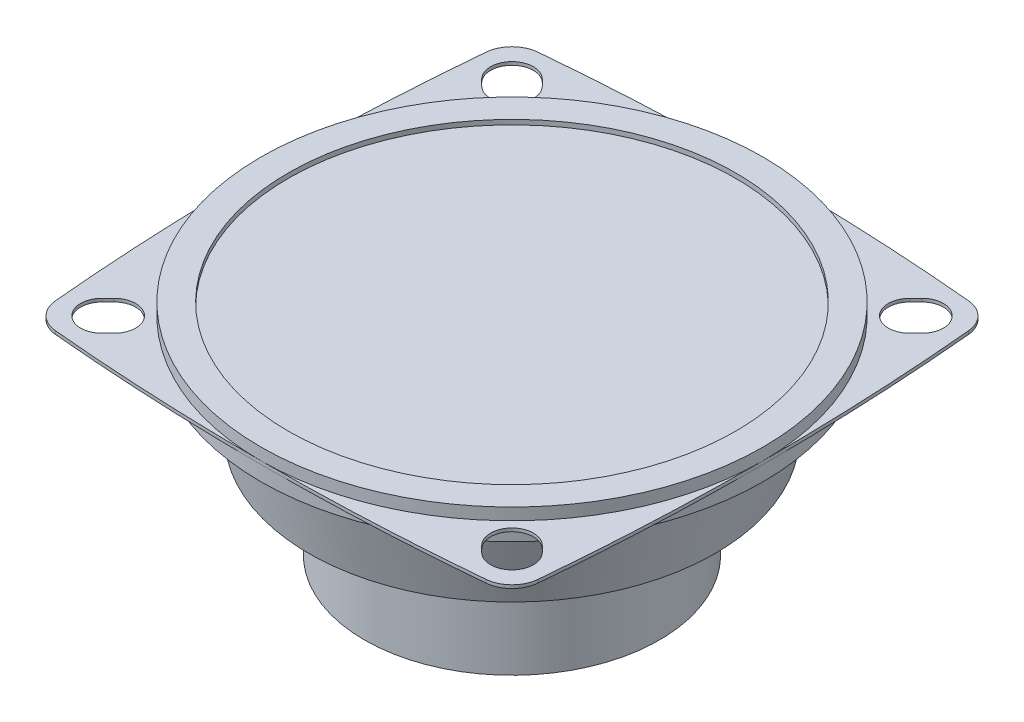
ISO-10303-21;
HEADER;
FILE_DESCRIPTION(('STEP AP214'),'2;1');
FILE_NAME('part.step','',(''),(''),'','','');
FILE_SCHEMA(('AUTOMOTIVE_DESIGN { 1 0 10303 214 1 1 1 1 }'));
ENDSEC;
DATA;
#1=APPLICATION_CONTEXT('core data for automotive mechanical design processes');
#2=APPLICATION_PROTOCOL_DEFINITION('international standard','automotive_design',2000,#1);
#3=PRODUCT_CONTEXT('',#1,'mechanical');
#4=PRODUCT('Part','Part','',(#3));
#5=PRODUCT_RELATED_PRODUCT_CATEGORY('part','',(#4));
#6=PRODUCT_DEFINITION_FORMATION('','',#4);
#7=PRODUCT_DEFINITION_CONTEXT('part definition',#1,'design');
#8=PRODUCT_DEFINITION('design','',#6,#7);
#9=PRODUCT_DEFINITION_SHAPE('','',#8);
#10=(LENGTH_UNIT() NAMED_UNIT(*) SI_UNIT(.MILLI.,.METRE.));
#11=(NAMED_UNIT(*) PLANE_ANGLE_UNIT() SI_UNIT($,.RADIAN.));
#12=(NAMED_UNIT(*) SI_UNIT($,.STERADIAN.) SOLID_ANGLE_UNIT());
#13=UNCERTAINTY_MEASURE_WITH_UNIT(LENGTH_MEASURE(1.E-05),#10,'distance_accuracy_value','');
#14=(GEOMETRIC_REPRESENTATION_CONTEXT(3) GLOBAL_UNCERTAINTY_ASSIGNED_CONTEXT((#13)) GLOBAL_UNIT_ASSIGNED_CONTEXT((#10,
#11,#12)) REPRESENTATION_CONTEXT('',''));
#15=CARTESIAN_POINT('',(0.,0.,0.));
#16=DIRECTION('',(0.,0.,1.));
#17=DIRECTION('',(1.,0.,0.));
#18=AXIS2_PLACEMENT_3D('',#15,#16,#17);
#19=CARTESIAN_POINT('',(0.,0.,0.));
#20=DIRECTION('',(0.,-1.,0.));
#21=DIRECTION('',(0.,0.,-1.));
#22=AXIS2_PLACEMENT_3D('',#19,#20,#21);
#23=CYLINDRICAL_SURFACE('',#22,26.38);
#24=CARTESIAN_POINT('',(0.,19.84,0.));
#25=DIRECTION('',(0.,-1.,0.));
#26=DIRECTION('',(0.,0.,-1.));
#27=AXIS2_PLACEMENT_3D('',#24,#25,#26);
#28=CIRCLE('',#27,26.38);
#29=CARTESIAN_POINT('',(0.,19.84,-26.38));
#30=VERTEX_POINT('',#29);
#31=EDGE_CURVE('E396',#30,#30,#28,.T.);
#32=ORIENTED_EDGE('',*,*,#31,.F.);
#33=EDGE_LOOP('',(#32));
#34=FACE_BOUND('',#33,.T.);
#35=CARTESIAN_POINT('',(0.,21.41,0.));
#36=DIRECTION('',(0.,1.,0.));
#37=DIRECTION('',(0.,0.,1.));
#38=AXIS2_PLACEMENT_3D('',#35,#36,#37);
#39=CIRCLE('',#38,26.38);
#40=CARTESIAN_POINT('',(26.38,21.41,0.));
#41=VERTEX_POINT('',#40);
#42=CARTESIAN_POINT('',(0.,21.41,26.38));
#43=VERTEX_POINT('',#42);
#44=EDGE_CURVE('E407',#41,#43,#39,.F.);
#45=ORIENTED_EDGE('',*,*,#44,.T.);
#46=CARTESIAN_POINT('',(-26.38,21.41,0.));
#47=VERTEX_POINT('',#46);
#48=EDGE_CURVE('E411',#43,#47,#39,.F.);
#49=ORIENTED_EDGE('',*,*,#48,.T.);
#50=CARTESIAN_POINT('',(0.,21.41,-26.38));
#51=VERTEX_POINT('',#50);
#52=EDGE_CURVE('E463',#47,#51,#39,.F.);
#53=ORIENTED_EDGE('',*,*,#52,.T.);
#54=EDGE_CURVE('E410',#51,#41,#39,.F.);
#55=ORIENTED_EDGE('',*,*,#54,.T.);
#56=EDGE_LOOP('',(#45,#49,#53,#55));
#57=FACE_BOUND('',#56,.T.);
#58=ADVANCED_FACE('F32',(#34,#57),#23,.T.);
#59=CARTESIAN_POINT('',(15.5,0.,0.));
#60=DIRECTION('',(0.,-1.,0.));
#61=DIRECTION('',(0.,0.,-1.));
#62=AXIS2_PLACEMENT_3D('',#59,#60,#61);
#63=PLANE('',#62);
#64=CARTESIAN_POINT('',(0.,0.,0.));
#65=DIRECTION('',(0.,-1.,0.));
#66=DIRECTION('',(0.,0.,-1.));
#67=AXIS2_PLACEMENT_3D('',#64,#65,#66);
#68=CIRCLE('',#67,15.5);
#69=CARTESIAN_POINT('',(0.,0.,-15.5));
#70=VERTEX_POINT('',#69);
#71=EDGE_CURVE('E373',#70,#70,#68,.T.);
#72=ORIENTED_EDGE('',*,*,#71,.T.);
#73=EDGE_LOOP('',(#72));
#74=FACE_BOUND('',#73,.T.);
#75=ADVANCED_FACE('F547',(#74),#63,.T.);
#76=CARTESIAN_POINT('',(26.38,19.84,0.));
#77=DIRECTION('',(0.,-1.,0.));
#78=DIRECTION('',(0.,0.,-1.));
#79=AXIS2_PLACEMENT_3D('',#76,#77,#78);
#80=PLANE('',#79);
#81=ORIENTED_EDGE('',*,*,#31,.T.);
#82=EDGE_LOOP('',(#81));
#83=FACE_BOUND('',#82,.T.);
#84=CARTESIAN_POINT('',(0.,19.84,0.));
#85=DIRECTION('',(0.,-1.,0.));
#86=DIRECTION('',(0.,0.,-1.));
#87=AXIS2_PLACEMENT_3D('',#84,#85,#86);
#88=CIRCLE('',#87,23.325);
#89=CARTESIAN_POINT('',(0.,19.84,-23.325));
#90=VERTEX_POINT('',#89);
#91=EDGE_CURVE('E393',#90,#90,#88,.T.);
#92=ORIENTED_EDGE('',*,*,#91,.F.);
#93=EDGE_LOOP('',(#92));
#94=FACE_BOUND('',#93,.T.);
#95=ADVANCED_FACE('F553',(#83,#94),#80,.T.);
#96=CARTESIAN_POINT('',(0.,10.8,0.));
#97=DIRECTION('',(0.,1.,0.));
#98=DIRECTION('',(0.,0.,1.));
#99=AXIS2_PLACEMENT_3D('',#96,#97,#98);
#100=CONICAL_SURFACE('',#99,21.35,0.215093764763829);
#101=ORIENTED_EDGE('',*,*,#91,.T.);
#102=EDGE_LOOP('',(#101));
#103=FACE_BOUND('',#102,.T.);
#104=CARTESIAN_POINT('',(0.,10.8,0.));
#105=DIRECTION('',(0.,-1.,0.));
#106=DIRECTION('',(0.,0.,-1.));
#107=AXIS2_PLACEMENT_3D('',#104,#105,#106);
#108=CIRCLE('',#107,21.35);
#109=CARTESIAN_POINT('',(0.,10.8,-21.35));
#110=VERTEX_POINT('',#109);
#111=EDGE_CURVE('E390',#110,#110,#108,.T.);
#112=ORIENTED_EDGE('',*,*,#111,.F.);
#113=EDGE_LOOP('',(#112));
#114=FACE_BOUND('',#113,.T.);
#115=ADVANCED_FACE('F676',(#103,#114),#100,.T.);
#116=CARTESIAN_POINT('',(0.,9.,0.));
#117=DIRECTION('',(0.,1.,0.));
#118=DIRECTION('',(0.,0.,1.));
#119=AXIS2_PLACEMENT_3D('',#116,#117,#118);
#120=CONICAL_SURFACE('',#119,15.5,1.27229739520872);
#121=ORIENTED_EDGE('',*,*,#111,.T.);
#122=EDGE_LOOP('',(#121));
#123=FACE_BOUND('',#122,.T.);
#124=CARTESIAN_POINT('',(0.,9.,0.));
#125=DIRECTION('',(0.,-1.,0.));
#126=DIRECTION('',(0.,0.,-1.));
#127=AXIS2_PLACEMENT_3D('',#124,#125,#126);
#128=CIRCLE('',#127,15.5);
#129=CARTESIAN_POINT('',(0.,9.,-15.5));
#130=VERTEX_POINT('',#129);
#131=EDGE_CURVE('E387',#130,#130,#128,.T.);
#132=ORIENTED_EDGE('',*,*,#131,.F.);
#133=EDGE_LOOP('',(#132));
#134=FACE_BOUND('',#133,.T.);
#135=ADVANCED_FACE('F672',(#123,#134),#120,.T.);
#136=CARTESIAN_POINT('',(0.,0.,0.));
#137=DIRECTION('',(0.,-1.,0.));
#138=DIRECTION('',(0.,0.,-1.));
#139=AXIS2_PLACEMENT_3D('',#136,#137,#138);
#140=CYLINDRICAL_SURFACE('',#139,15.5);
#141=ORIENTED_EDGE('',*,*,#131,.T.);
#142=EDGE_LOOP('',(#141));
#143=FACE_BOUND('',#142,.T.);
#144=ORIENTED_EDGE('',*,*,#71,.F.);
#145=EDGE_LOOP('',(#144));
#146=FACE_BOUND('',#145,.T.);
#147=ADVANCED_FACE('F669',(#143,#146),#140,.T.);
#148=CARTESIAN_POINT('',(220.842727758187,21.41,0.));
#149=DIRECTION('',(0.,1.,0.));
#150=DIRECTION('',(0.,0.,1.));
#151=AXIS2_PLACEMENT_3D('',#148,#149,#150);
#152=CYLINDRICAL_SURFACE('',#151,247.222727758187);
#153=CARTESIAN_POINT('',(220.842727758187,21.41,0.));
#154=DIRECTION('',(0.,1.,0.));
#155=DIRECTION('',(0.,0.,1.));
#156=AXIS2_PLACEMENT_3D('',#153,#154,#155);
#157=CIRCLE('',#156,247.222727758187);
#158=CARTESIAN_POINT('',(-25.342142084082,21.41,22.6293389418186));
#159=VERTEX_POINT('',#158);
#160=EDGE_CURVE('E364',#47,#159,#157,.T.);
#161=ORIENTED_EDGE('',*,*,#160,.T.);
#162=DIRECTION('',(0.,1.,0.));
#163=VECTOR('',#162,1.);
#164=CARTESIAN_POINT('',(-25.342142084082,21.41,22.6293389418186));
#165=LINE('',#164,#163);
#166=CARTESIAN_POINT('',(-25.342142084082,21.75,22.6293389418186));
#167=VERTEX_POINT('',#166);
#168=EDGE_CURVE('E414',#159,#167,#165,.T.);
#169=ORIENTED_EDGE('',*,*,#168,.T.);
#170=CARTESIAN_POINT('',(220.842727758187,21.75,0.));
#171=DIRECTION('',(0.,1.,0.));
#172=DIRECTION('',(0.,0.,1.));
#173=AXIS2_PLACEMENT_3D('',#170,#171,#172);
#174=CIRCLE('',#173,247.222727758187);
#175=CARTESIAN_POINT('',(-26.38,21.75,0.));
#176=VERTEX_POINT('',#175);
#177=EDGE_CURVE('E354',#176,#167,#174,.T.);
#178=ORIENTED_EDGE('',*,*,#177,.F.);
#179=CARTESIAN_POINT('',(-25.342142084082,21.75,-22.6293389418185));
#180=VERTEX_POINT('',#179);
#181=EDGE_CURVE('E374',#180,#176,#174,.T.);
#182=ORIENTED_EDGE('',*,*,#181,.F.);
#183=DIRECTION('',(0.,1.,0.));
#184=VECTOR('',#183,1.);
#185=CARTESIAN_POINT('',(-25.342142084082,21.41,-22.6293389418186));
#186=LINE('',#185,#184);
#187=CARTESIAN_POINT('',(-25.342142084082,21.41,-22.6293389418185));
#188=VERTEX_POINT('',#187);
#189=EDGE_CURVE('E412',#180,#188,#186,.F.);
#190=ORIENTED_EDGE('',*,*,#189,.T.);
#191=EDGE_CURVE('E361',#188,#47,#157,.T.);
#192=ORIENTED_EDGE('',*,*,#191,.T.);
#193=EDGE_LOOP('',(#161,#169,#178,#182,#190,#192));
#194=FACE_BOUND('',#193,.T.);
#195=ADVANCED_FACE('F455',(#194),#152,.T.);
#196=CARTESIAN_POINT('',(0.,21.41,220.842727758187));
#197=DIRECTION('',(0.,1.,0.));
#198=DIRECTION('',(0.,0.,1.));
#199=AXIS2_PLACEMENT_3D('',#196,#197,#198);
#200=CYLINDRICAL_SURFACE('',#199,247.222727758187);
#201=CARTESIAN_POINT('',(0.,21.75,220.842727758187));
#202=DIRECTION('',(0.,1.,0.));
#203=DIRECTION('',(0.,0.,1.));
#204=AXIS2_PLACEMENT_3D('',#201,#202,#203);
#205=CIRCLE('',#204,247.222727758187);
#206=CARTESIAN_POINT('',(22.6293389418186,21.75,-25.342142084082));
#207=VERTEX_POINT('',#206);
#208=CARTESIAN_POINT('',(0.,21.75,-26.38));
#209=VERTEX_POINT('',#208);
#210=EDGE_CURVE('E383',#207,#209,#205,.T.);
#211=ORIENTED_EDGE('',*,*,#210,.F.);
#212=DIRECTION('',(0.,1.,0.));
#213=VECTOR('',#212,1.);
#214=CARTESIAN_POINT('',(22.6293389418186,21.41,-25.342142084082));
#215=LINE('',#214,#213);
#216=CARTESIAN_POINT('',(22.6293389418186,21.41,-25.342142084082));
#217=VERTEX_POINT('',#216);
#218=EDGE_CURVE('E53',#207,#217,#215,.F.);
#219=ORIENTED_EDGE('',*,*,#218,.T.);
#220=CARTESIAN_POINT('',(0.,21.41,220.842727758187));
#221=DIRECTION('',(0.,1.,0.));
#222=DIRECTION('',(0.,0.,1.));
#223=AXIS2_PLACEMENT_3D('',#220,#221,#222);
#224=CIRCLE('',#223,247.222727758187);
#225=EDGE_CURVE('E371',#217,#51,#224,.T.);
#226=ORIENTED_EDGE('',*,*,#225,.T.);
#227=CARTESIAN_POINT('',(-22.6293389418185,21.41,-25.342142084082));
#228=VERTEX_POINT('',#227);
#229=EDGE_CURVE('E370',#51,#228,#224,.T.);
#230=ORIENTED_EDGE('',*,*,#229,.T.);
#231=DIRECTION('',(0.,1.,0.));
#232=VECTOR('',#231,1.);
#233=CARTESIAN_POINT('',(-22.6293389418185,21.41,-25.342142084082));
#234=LINE('',#233,#232);
#235=CARTESIAN_POINT('',(-22.6293389418185,21.75,-25.342142084082));
#236=VERTEX_POINT('',#235);
#237=EDGE_CURVE('E437',#228,#236,#234,.T.);
#238=ORIENTED_EDGE('',*,*,#237,.T.);
#239=EDGE_CURVE('E382',#209,#236,#205,.T.);
#240=ORIENTED_EDGE('',*,*,#239,.F.);
#241=EDGE_LOOP('',(#211,#219,#226,#230,#238,#240));
#242=FACE_BOUND('',#241,.T.);
#243=ADVANCED_FACE('F457',(#242),#200,.T.);
#244=CARTESIAN_POINT('',(-220.84272775819,21.41,0.));
#245=DIRECTION('',(0.,1.,0.));
#246=DIRECTION('',(0.,0.,1.));
#247=AXIS2_PLACEMENT_3D('',#244,#245,#246);
#248=CYLINDRICAL_SURFACE('',#247,247.22272775819);
#249=CARTESIAN_POINT('',(-220.84272775819,21.75,0.));
#250=DIRECTION('',(0.,1.,0.));
#251=DIRECTION('',(0.,0.,1.));
#252=AXIS2_PLACEMENT_3D('',#249,#250,#251);
#253=CIRCLE('',#252,247.22272775819);
#254=CARTESIAN_POINT('',(25.342142084082,21.75,22.6293389418186));
#255=VERTEX_POINT('',#254);
#256=CARTESIAN_POINT('',(26.38,21.75,0.));
#257=VERTEX_POINT('',#256);
#258=EDGE_CURVE('E380',#255,#257,#253,.T.);
#259=ORIENTED_EDGE('',*,*,#258,.F.);
#260=DIRECTION('',(0.,1.,0.));
#261=VECTOR('',#260,1.);
#262=CARTESIAN_POINT('',(25.3421420840821,21.41,22.6293389418186));
#263=LINE('',#262,#261);
#264=CARTESIAN_POINT('',(25.342142084082,21.41,22.6293389418186));
#265=VERTEX_POINT('',#264);
#266=EDGE_CURVE('E431',#255,#265,#263,.F.);
#267=ORIENTED_EDGE('',*,*,#266,.T.);
#268=CARTESIAN_POINT('',(-220.84272775819,21.41,0.));
#269=DIRECTION('',(0.,1.,0.));
#270=DIRECTION('',(0.,0.,1.));
#271=AXIS2_PLACEMENT_3D('',#268,#269,#270);
#272=CIRCLE('',#271,247.22272775819);
#273=EDGE_CURVE('E368',#265,#41,#272,.T.);
#274=ORIENTED_EDGE('',*,*,#273,.T.);
#275=CARTESIAN_POINT('',(25.342142084082,21.41,-22.6293389418186));
#276=VERTEX_POINT('',#275);
#277=EDGE_CURVE('E367',#41,#276,#272,.T.);
#278=ORIENTED_EDGE('',*,*,#277,.T.);
#279=DIRECTION('',(0.,1.,0.));
#280=VECTOR('',#279,1.);
#281=CARTESIAN_POINT('',(25.342142084082,21.41,-22.6293389418186));
#282=LINE('',#281,#280);
#283=CARTESIAN_POINT('',(25.342142084082,21.75,-22.6293389418186));
#284=VERTEX_POINT('',#283);
#285=EDGE_CURVE('E428',#276,#284,#282,.T.);
#286=ORIENTED_EDGE('',*,*,#285,.T.);
#287=EDGE_CURVE('E379',#257,#284,#253,.T.);
#288=ORIENTED_EDGE('',*,*,#287,.F.);
#289=EDGE_LOOP('',(#259,#267,#274,#278,#286,#288));
#290=FACE_BOUND('',#289,.T.);
#291=ADVANCED_FACE('F503',(#290),#248,.T.);
#292=CARTESIAN_POINT('',(0.,21.41,-220.84272775819));
#293=DIRECTION('',(0.,1.,0.));
#294=DIRECTION('',(0.,0.,1.));
#295=AXIS2_PLACEMENT_3D('',#292,#293,#294);
#296=CYLINDRICAL_SURFACE('',#295,247.22272775819);
#297=CARTESIAN_POINT('',(0.,21.75,-220.84272775819));
#298=DIRECTION('',(0.,1.,0.));
#299=DIRECTION('',(0.,0.,1.));
#300=AXIS2_PLACEMENT_3D('',#297,#298,#299);
#301=CIRCLE('',#300,247.22272775819);
#302=CARTESIAN_POINT('',(-22.6293389418185,21.75,25.3421420840821));
#303=VERTEX_POINT('',#302);
#304=CARTESIAN_POINT('',(0.,21.75,26.38));
#305=VERTEX_POINT('',#304);
#306=EDGE_CURVE('E377',#303,#305,#301,.T.);
#307=ORIENTED_EDGE('',*,*,#306,.F.);
#308=DIRECTION('',(0.,1.,0.));
#309=VECTOR('',#308,1.);
#310=CARTESIAN_POINT('',(-22.6293389418185,21.41,25.3421420840821));
#311=LINE('',#310,#309);
#312=CARTESIAN_POINT('',(-22.6293389418185,21.41,25.3421420840821));
#313=VERTEX_POINT('',#312);
#314=EDGE_CURVE('E422',#303,#313,#311,.F.);
#315=ORIENTED_EDGE('',*,*,#314,.T.);
#316=CARTESIAN_POINT('',(0.,21.41,-220.84272775819));
#317=DIRECTION('',(0.,1.,0.));
#318=DIRECTION('',(0.,0.,1.));
#319=AXIS2_PLACEMENT_3D('',#316,#317,#318);
#320=CIRCLE('',#319,247.22272775819);
#321=EDGE_CURVE('E365',#313,#43,#320,.T.);
#322=ORIENTED_EDGE('',*,*,#321,.T.);
#323=CARTESIAN_POINT('',(22.6293389418186,21.41,25.342142084082));
#324=VERTEX_POINT('',#323);
#325=EDGE_CURVE('E363',#43,#324,#320,.T.);
#326=ORIENTED_EDGE('',*,*,#325,.T.);
#327=DIRECTION('',(0.,1.,0.));
#328=VECTOR('',#327,1.);
#329=CARTESIAN_POINT('',(22.6293389418186,21.41,25.342142084082));
#330=LINE('',#329,#328);
#331=CARTESIAN_POINT('',(22.6293389418186,21.75,25.342142084082));
#332=VERTEX_POINT('',#331);
#333=EDGE_CURVE('E419',#324,#332,#330,.T.);
#334=ORIENTED_EDGE('',*,*,#333,.T.);
#335=EDGE_CURVE('E376',#305,#332,#301,.T.);
#336=ORIENTED_EDGE('',*,*,#335,.F.);
#337=EDGE_LOOP('',(#307,#315,#322,#326,#334,#336));
#338=FACE_BOUND('',#337,.T.);
#339=ADVANCED_FACE('F484',(#338),#296,.T.);
#340=CARTESIAN_POINT('',(110.421363879094,21.41,-110.421363879095));
#341=DIRECTION('',(0.,1.,0.));
#342=DIRECTION('',(0.,0.,1.));
#343=AXIS2_PLACEMENT_3D('',#340,#341,#342);
#344=PLANE('',#343);
#345=ORIENTED_EDGE('',*,*,#321,.F.);
#346=CARTESIAN_POINT('',(-22.3547362892183,21.41,22.3547362892184));
#347=DIRECTION('',(0.,1.,0.));
#348=DIRECTION('',(0.,0.,1.));
#349=AXIS2_PLACEMENT_3D('',#346,#347,#348);
#350=CIRCLE('',#349,3.);
#351=EDGE_CURVE('E424',#313,#159,#350,.F.);
#352=ORIENTED_EDGE('',*,*,#351,.T.);
#353=ORIENTED_EDGE('',*,*,#160,.F.);
#354=ORIENTED_EDGE('',*,*,#48,.F.);
#355=EDGE_LOOP('',(#345,#352,#353,#354));
#356=FACE_BOUND('',#355,.T.);
#357=DIRECTION('',(-0.707106781186547,0.,0.707106781186547));
#358=VECTOR('',#357,1.);
#359=CARTESIAN_POINT('',(-23.1223917448001,21.41,19.9404112294606));
#360=LINE('',#359,#358);
#361=CARTESIAN_POINT('',(-22.4859956417322,21.41,19.3040151263927));
#362=VERTEX_POINT('',#361);
#363=CARTESIAN_POINT('',(-23.1223917448001,21.41,19.9404112294606));
#364=VERTEX_POINT('',#363);
#365=EDGE_CURVE('E230',#362,#364,#360,.T.);
#366=ORIENTED_EDGE('',*,*,#365,.T.);
#367=CARTESIAN_POINT('',(-21.5314014871304,21.41,21.5314014871304));
#368=DIRECTION('',(0.,1.,0.));
#369=DIRECTION('',(0.,0.,1.));
#370=AXIS2_PLACEMENT_3D('',#367,#368,#369);
#371=CIRCLE('',#370,2.25000000000001);
#372=CARTESIAN_POINT('',(-19.9404112294606,21.41,23.1223917448001));
#373=VERTEX_POINT('',#372);
#374=EDGE_CURVE('E222',#364,#373,#371,.T.);
#375=ORIENTED_EDGE('',*,*,#374,.T.);
#376=DIRECTION('',(0.707106781186548,0.,-0.707106781186548));
#377=VECTOR('',#376,1.);
#378=CARTESIAN_POINT('',(-19.9404112294606,21.41,23.1223917448001));
#379=LINE('',#378,#377);
#380=CARTESIAN_POINT('',(-19.3040151263927,21.41,22.4859956417322));
#381=VERTEX_POINT('',#380);
#382=EDGE_CURVE('E234',#373,#381,#379,.T.);
#383=ORIENTED_EDGE('',*,*,#382,.T.);
#384=CARTESIAN_POINT('',(-20.8950053840625,21.41,20.8950053840625));
#385=DIRECTION('',(0.,1.,0.));
#386=DIRECTION('',(0.,0.,1.));
#387=AXIS2_PLACEMENT_3D('',#384,#385,#386);
#388=CIRCLE('',#387,2.25000000000001);
#389=EDGE_CURVE('E238',#381,#362,#388,.T.);
#390=ORIENTED_EDGE('',*,*,#389,.T.);
#391=EDGE_LOOP('',(#366,#375,#383,#390));
#392=FACE_BOUND('',#391,.T.);
#393=ADVANCED_FACE('F240',(#356,#392),#344,.F.);
#394=ORIENTED_EDGE('',*,*,#191,.F.);
#395=CARTESIAN_POINT('',(-22.3547362892183,21.41,-22.3547362892183));
#396=DIRECTION('',(0.,1.,0.));
#397=DIRECTION('',(0.,0.,1.));
#398=AXIS2_PLACEMENT_3D('',#395,#396,#397);
#399=CIRCLE('',#398,3.);
#400=EDGE_CURVE('E11',#188,#228,#399,.F.);
#401=ORIENTED_EDGE('',*,*,#400,.T.);
#402=ORIENTED_EDGE('',*,*,#229,.F.);
#403=ORIENTED_EDGE('',*,*,#52,.F.);
#404=EDGE_LOOP('',(#394,#401,#402,#403));
#405=FACE_BOUND('',#404,.T.);
#406=DIRECTION('',(-0.70710678118655,0.,-0.707106781186546));
#407=VECTOR('',#406,1.);
#408=CARTESIAN_POINT('',(-19.9404112294606,21.41,-23.1223917448001));
#409=LINE('',#408,#407);
#410=CARTESIAN_POINT('',(-19.3040151263927,21.41,-22.4859956417322));
#411=VERTEX_POINT('',#410);
#412=CARTESIAN_POINT('',(-19.9404112294606,21.41,-23.1223917448001));
#413=VERTEX_POINT('',#412);
#414=EDGE_CURVE('E339',#411,#413,#409,.T.);
#415=ORIENTED_EDGE('',*,*,#414,.T.);
#416=CARTESIAN_POINT('',(-21.5314014871304,21.41,-21.5314014871304));
#417=DIRECTION('',(0.,1.,0.));
#418=DIRECTION('',(0.,0.,1.));
#419=AXIS2_PLACEMENT_3D('',#416,#417,#418);
#420=CIRCLE('',#419,2.25);
#421=CARTESIAN_POINT('',(-23.1223917448001,21.41,-19.9404112294606));
#422=VERTEX_POINT('',#421);
#423=EDGE_CURVE('E329',#413,#422,#420,.T.);
#424=ORIENTED_EDGE('',*,*,#423,.T.);
#425=DIRECTION('',(0.70710678118655,0.,0.707106781186546));
#426=VECTOR('',#425,1.);
#427=CARTESIAN_POINT('',(-23.1223917448001,21.41,-19.9404112294606));
#428=LINE('',#427,#426);
#429=CARTESIAN_POINT('',(-22.4859956417322,21.41,-19.3040151263928));
#430=VERTEX_POINT('',#429);
#431=EDGE_CURVE('E332',#422,#430,#428,.T.);
#432=ORIENTED_EDGE('',*,*,#431,.T.);
#433=CARTESIAN_POINT('',(-20.8950053840625,21.41,-20.8950053840625));
#434=DIRECTION('',(0.,1.,0.));
#435=DIRECTION('',(0.,0.,1.));
#436=AXIS2_PLACEMENT_3D('',#433,#434,#435);
#437=CIRCLE('',#436,2.25);
#438=EDGE_CURVE('E336',#430,#411,#437,.T.);
#439=ORIENTED_EDGE('',*,*,#438,.T.);
#440=EDGE_LOOP('',(#415,#424,#432,#439));
#441=FACE_BOUND('',#440,.T.);
#442=ADVANCED_FACE('F461',(#405,#441),#344,.F.);
#443=ORIENTED_EDGE('',*,*,#225,.F.);
#444=CARTESIAN_POINT('',(22.3547362892184,21.41,-22.3547362892184));
#445=DIRECTION('',(0.,1.,0.));
#446=DIRECTION('',(0.,0.,1.));
#447=AXIS2_PLACEMENT_3D('',#444,#445,#446);
#448=CIRCLE('',#447,3.);
#449=EDGE_CURVE('E441',#217,#276,#448,.F.);
#450=ORIENTED_EDGE('',*,*,#449,.T.);
#451=ORIENTED_EDGE('',*,*,#277,.F.);
#452=ORIENTED_EDGE('',*,*,#54,.F.);
#453=EDGE_LOOP('',(#443,#450,#451,#452));
#454=FACE_BOUND('',#453,.T.);
#455=DIRECTION('',(0.707106781186548,0.,-0.707106781186548));
#456=VECTOR('',#455,1.);
#457=CARTESIAN_POINT('',(23.1223917448001,21.41,-19.9404112294606));
#458=LINE('',#457,#456);
#459=CARTESIAN_POINT('',(22.4859956417322,21.41,-19.3040151263927));
#460=VERTEX_POINT('',#459);
#461=CARTESIAN_POINT('',(23.1223917448001,21.41,-19.9404112294606));
#462=VERTEX_POINT('',#461);
#463=EDGE_CURVE('E307',#460,#462,#458,.T.);
#464=ORIENTED_EDGE('',*,*,#463,.T.);
#465=CARTESIAN_POINT('',(21.5314014871304,21.41,-21.5314014871304));
#466=DIRECTION('',(0.,1.,0.));
#467=DIRECTION('',(0.,0.,1.));
#468=AXIS2_PLACEMENT_3D('',#465,#466,#467);
#469=CIRCLE('',#468,2.25);
#470=CARTESIAN_POINT('',(19.9404112294607,21.41,-23.1223917448001));
#471=VERTEX_POINT('',#470);
#472=EDGE_CURVE('E297',#462,#471,#469,.T.);
#473=ORIENTED_EDGE('',*,*,#472,.T.);
#474=DIRECTION('',(-0.707106781186548,0.,0.707106781186548));
#475=VECTOR('',#474,1.);
#476=CARTESIAN_POINT('',(19.9404112294607,21.41,-23.1223917448001));
#477=LINE('',#476,#475);
#478=CARTESIAN_POINT('',(19.3040151263928,21.41,-22.4859956417322));
#479=VERTEX_POINT('',#478);
#480=EDGE_CURVE('E300',#471,#479,#477,.T.);
#481=ORIENTED_EDGE('',*,*,#480,.T.);
#482=CARTESIAN_POINT('',(20.8950053840625,21.41,-20.8950053840625));
#483=DIRECTION('',(0.,1.,0.));
#484=DIRECTION('',(0.,0.,1.));
#485=AXIS2_PLACEMENT_3D('',#482,#483,#484);
#486=CIRCLE('',#485,2.25);
#487=EDGE_CURVE('E304',#479,#460,#486,.T.);
#488=ORIENTED_EDGE('',*,*,#487,.T.);
#489=EDGE_LOOP('',(#464,#473,#481,#488));
#490=FACE_BOUND('',#489,.T.);
#491=ADVANCED_FACE('F512',(#454,#490),#344,.F.);
#492=CARTESIAN_POINT('',(110.421363879094,21.75,-110.421363879095));
#493=DIRECTION('',(0.,1.,0.));
#494=DIRECTION('',(0.,0.,1.));
#495=AXIS2_PLACEMENT_3D('',#492,#493,#494);
#496=PLANE('',#495);
#497=CARTESIAN_POINT('',(-21.5314014871304,21.75,21.5314014871304));
#498=DIRECTION('',(0.,1.,0.));
#499=DIRECTION('',(0.,0.,1.));
#500=AXIS2_PLACEMENT_3D('',#497,#498,#499);
#501=CIRCLE('',#500,2.25000000000001);
#502=CARTESIAN_POINT('',(-23.1223917448001,21.75,19.9404112294606));
#503=VERTEX_POINT('',#502);
#504=CARTESIAN_POINT('',(-19.9404112294606,21.75,23.1223917448001));
#505=VERTEX_POINT('',#504);
#506=EDGE_CURVE('E225',#503,#505,#501,.T.);
#507=ORIENTED_EDGE('',*,*,#506,.F.);
#508=DIRECTION('',(-0.707106781186547,0.,0.707106781186547));
#509=VECTOR('',#508,1.);
#510=CARTESIAN_POINT('',(-23.1223917448001,21.75,19.9404112294606));
#511=LINE('',#510,#509);
#512=CARTESIAN_POINT('',(-22.4859956417322,21.75,19.3040151263927));
#513=VERTEX_POINT('',#512);
#514=EDGE_CURVE('E242',#513,#503,#511,.T.);
#515=ORIENTED_EDGE('',*,*,#514,.F.);
#516=CARTESIAN_POINT('',(-20.8950053840625,21.75,20.8950053840625));
#517=DIRECTION('',(0.,1.,0.));
#518=DIRECTION('',(0.,0.,1.));
#519=AXIS2_PLACEMENT_3D('',#516,#517,#518);
#520=CIRCLE('',#519,2.25000000000001);
#521=CARTESIAN_POINT('',(-19.3040151263927,21.75,22.4859956417322));
#522=VERTEX_POINT('',#521);
#523=EDGE_CURVE('E245',#522,#513,#520,.T.);
#524=ORIENTED_EDGE('',*,*,#523,.F.);
#525=DIRECTION('',(0.707106781186548,0.,-0.707106781186548));
#526=VECTOR('',#525,1.);
#527=CARTESIAN_POINT('',(-19.9404112294606,21.75,23.1223917448001));
#528=LINE('',#527,#526);
#529=EDGE_CURVE('E254',#505,#522,#528,.T.);
#530=ORIENTED_EDGE('',*,*,#529,.F.);
#531=EDGE_LOOP('',(#507,#515,#524,#530));
#532=FACE_BOUND('',#531,.T.);
#533=ORIENTED_EDGE('',*,*,#177,.T.);
#534=CARTESIAN_POINT('',(-22.3547362892183,21.75,22.3547362892184));
#535=DIRECTION('',(0.,1.,0.));
#536=DIRECTION('',(0.,0.,1.));
#537=AXIS2_PLACEMENT_3D('',#534,#535,#536);
#538=CIRCLE('',#537,3.);
#539=EDGE_CURVE('E417',#167,#303,#538,.T.);
#540=ORIENTED_EDGE('',*,*,#539,.T.);
#541=ORIENTED_EDGE('',*,*,#306,.T.);
#542=CARTESIAN_POINT('',(0.,21.75,0.));
#543=DIRECTION('',(0.,1.,0.));
#544=DIRECTION('',(0.,0.,1.));
#545=AXIS2_PLACEMENT_3D('',#542,#543,#544);
#546=CIRCLE('',#545,26.38);
#547=EDGE_CURVE('E406',#305,#176,#546,.F.);
#548=ORIENTED_EDGE('',*,*,#547,.T.);
#549=EDGE_LOOP('',(#533,#540,#541,#548));
#550=FACE_BOUND('',#549,.T.);
#551=ADVANCED_FACE('F479',(#532,#550),#496,.T.);
#552=CARTESIAN_POINT('',(-21.5314014871304,21.75,-21.5314014871304));
#553=DIRECTION('',(0.,1.,0.));
#554=DIRECTION('',(0.,0.,1.));
#555=AXIS2_PLACEMENT_3D('',#552,#553,#554);
#556=CIRCLE('',#555,2.25);
#557=CARTESIAN_POINT('',(-19.9404112294606,21.75,-23.1223917448001));
#558=VERTEX_POINT('',#557);
#559=CARTESIAN_POINT('',(-23.1223917448001,21.75,-19.9404112294606));
#560=VERTEX_POINT('',#559);
#561=EDGE_CURVE('E322',#558,#560,#556,.T.);
#562=ORIENTED_EDGE('',*,*,#561,.F.);
#563=DIRECTION('',(-0.70710678118655,0.,-0.707106781186546));
#564=VECTOR('',#563,1.);
#565=CARTESIAN_POINT('',(-19.9404112294606,21.75,-23.1223917448001));
#566=LINE('',#565,#564);
#567=CARTESIAN_POINT('',(-19.3040151263927,21.75,-22.4859956417322));
#568=VERTEX_POINT('',#567);
#569=EDGE_CURVE('E333',#568,#558,#566,.T.);
#570=ORIENTED_EDGE('',*,*,#569,.F.);
#571=CARTESIAN_POINT('',(-20.8950053840625,21.75,-20.8950053840625));
#572=DIRECTION('',(0.,1.,0.));
#573=DIRECTION('',(0.,0.,1.));
#574=AXIS2_PLACEMENT_3D('',#571,#572,#573);
#575=CIRCLE('',#574,2.25);
#576=CARTESIAN_POINT('',(-22.4859956417322,21.75,-19.3040151263927));
#577=VERTEX_POINT('',#576);
#578=EDGE_CURVE('E347',#577,#568,#575,.T.);
#579=ORIENTED_EDGE('',*,*,#578,.F.);
#580=DIRECTION('',(0.70710678118655,0.,0.707106781186546));
#581=VECTOR('',#580,1.);
#582=CARTESIAN_POINT('',(-23.1223917448001,21.75,-19.9404112294606));
#583=LINE('',#582,#581);
#584=EDGE_CURVE('E344',#560,#577,#583,.T.);
#585=ORIENTED_EDGE('',*,*,#584,.F.);
#586=EDGE_LOOP('',(#562,#570,#579,#585));
#587=FACE_BOUND('',#586,.T.);
#588=ORIENTED_EDGE('',*,*,#239,.T.);
#589=CARTESIAN_POINT('',(-22.3547362892183,21.75,-22.3547362892183));
#590=DIRECTION('',(0.,1.,0.));
#591=DIRECTION('',(0.,0.,1.));
#592=AXIS2_PLACEMENT_3D('',#589,#590,#591);
#593=CIRCLE('',#592,3.);
#594=EDGE_CURVE('E40',#236,#180,#593,.T.);
#595=ORIENTED_EDGE('',*,*,#594,.T.);
#596=ORIENTED_EDGE('',*,*,#181,.T.);
#597=EDGE_CURVE('E501',#176,#209,#546,.F.);
#598=ORIENTED_EDGE('',*,*,#597,.T.);
#599=EDGE_LOOP('',(#588,#595,#596,#598));
#600=FACE_BOUND('',#599,.T.);
#601=ADVANCED_FACE('F445',(#587,#600),#496,.T.);
#602=CARTESIAN_POINT('',(21.5314014871304,21.75,-21.5314014871304));
#603=DIRECTION('',(0.,1.,0.));
#604=DIRECTION('',(0.,0.,1.));
#605=AXIS2_PLACEMENT_3D('',#602,#603,#604);
#606=CIRCLE('',#605,2.25);
#607=CARTESIAN_POINT('',(23.1223917448001,21.75,-19.9404112294606));
#608=VERTEX_POINT('',#607);
#609=CARTESIAN_POINT('',(19.9404112294607,21.75,-23.1223917448001));
#610=VERTEX_POINT('',#609);
#611=EDGE_CURVE('E290',#608,#610,#606,.T.);
#612=ORIENTED_EDGE('',*,*,#611,.F.);
#613=DIRECTION('',(0.707106781186548,0.,-0.707106781186548));
#614=VECTOR('',#613,1.);
#615=CARTESIAN_POINT('',(23.1223917448001,21.75,-19.9404112294606));
#616=LINE('',#615,#614);
#617=CARTESIAN_POINT('',(22.4859956417322,21.75,-19.3040151263927));
#618=VERTEX_POINT('',#617);
#619=EDGE_CURVE('E301',#618,#608,#616,.T.);
#620=ORIENTED_EDGE('',*,*,#619,.F.);
#621=CARTESIAN_POINT('',(20.8950053840625,21.75,-20.8950053840625));
#622=DIRECTION('',(0.,1.,0.));
#623=DIRECTION('',(0.,0.,1.));
#624=AXIS2_PLACEMENT_3D('',#621,#622,#623);
#625=CIRCLE('',#624,2.25);
#626=CARTESIAN_POINT('',(19.3040151263928,21.75,-22.4859956417322));
#627=VERTEX_POINT('',#626);
#628=EDGE_CURVE('E315',#627,#618,#625,.T.);
#629=ORIENTED_EDGE('',*,*,#628,.F.);
#630=DIRECTION('',(-0.707106781186548,0.,0.707106781186548));
#631=VECTOR('',#630,1.);
#632=CARTESIAN_POINT('',(19.9404112294607,21.75,-23.1223917448001));
#633=LINE('',#632,#631);
#634=EDGE_CURVE('E312',#610,#627,#633,.T.);
#635=ORIENTED_EDGE('',*,*,#634,.F.);
#636=EDGE_LOOP('',(#612,#620,#629,#635));
#637=FACE_BOUND('',#636,.T.);
#638=ORIENTED_EDGE('',*,*,#287,.T.);
#639=CARTESIAN_POINT('',(22.3547362892184,21.75,-22.3547362892184));
#640=DIRECTION('',(0.,1.,0.));
#641=DIRECTION('',(0.,0.,1.));
#642=AXIS2_PLACEMENT_3D('',#639,#640,#641);
#643=CIRCLE('',#642,3.);
#644=EDGE_CURVE('E435',#284,#207,#643,.T.);
#645=ORIENTED_EDGE('',*,*,#644,.T.);
#646=ORIENTED_EDGE('',*,*,#210,.T.);
#647=EDGE_CURVE('E405',#209,#257,#546,.F.);
#648=ORIENTED_EDGE('',*,*,#647,.T.);
#649=EDGE_LOOP('',(#638,#645,#646,#648));
#650=FACE_BOUND('',#649,.T.);
#651=ADVANCED_FACE('F500',(#637,#650),#496,.T.);
#652=ORIENTED_EDGE('',*,*,#273,.F.);
#653=CARTESIAN_POINT('',(22.3547362892184,21.41,22.3547362892184));
#654=DIRECTION('',(0.,1.,0.));
#655=DIRECTION('',(0.,0.,1.));
#656=AXIS2_PLACEMENT_3D('',#653,#654,#655);
#657=CIRCLE('',#656,3.);
#658=EDGE_CURVE('E433',#265,#324,#657,.F.);
#659=ORIENTED_EDGE('',*,*,#658,.T.);
#660=ORIENTED_EDGE('',*,*,#325,.F.);
#661=ORIENTED_EDGE('',*,*,#44,.F.);
#662=EDGE_LOOP('',(#652,#659,#660,#661));
#663=FACE_BOUND('',#662,.T.);
#664=DIRECTION('',(0.707106781186547,0.,0.707106781186547));
#665=VECTOR('',#664,1.);
#666=CARTESIAN_POINT('',(19.9404112294606,21.41,23.1223917448001));
#667=LINE('',#666,#665);
#668=CARTESIAN_POINT('',(19.3040151263928,21.41,22.4859956417322));
#669=VERTEX_POINT('',#668);
#670=CARTESIAN_POINT('',(19.9404112294606,21.41,23.1223917448001));
#671=VERTEX_POINT('',#670);
#672=EDGE_CURVE('E275',#669,#671,#667,.T.);
#673=ORIENTED_EDGE('',*,*,#672,.T.);
#674=CARTESIAN_POINT('',(21.5314014871304,21.41,21.5314014871304));
#675=DIRECTION('',(0.,1.,0.));
#676=DIRECTION('',(0.,0.,1.));
#677=AXIS2_PLACEMENT_3D('',#674,#675,#676);
#678=CIRCLE('',#677,2.25000000000001);
#679=CARTESIAN_POINT('',(23.1223917448001,21.41,19.9404112294606));
#680=VERTEX_POINT('',#679);
#681=EDGE_CURVE('E265',#671,#680,#678,.T.);
#682=ORIENTED_EDGE('',*,*,#681,.T.);
#683=DIRECTION('',(-0.707106781186547,0.,-0.707106781186547));
#684=VECTOR('',#683,1.);
#685=CARTESIAN_POINT('',(23.1223917448001,21.41,19.9404112294606));
#686=LINE('',#685,#684);
#687=CARTESIAN_POINT('',(22.4859956417322,21.41,19.3040151263928));
#688=VERTEX_POINT('',#687);
#689=EDGE_CURVE('E268',#680,#688,#686,.T.);
#690=ORIENTED_EDGE('',*,*,#689,.T.);
#691=CARTESIAN_POINT('',(20.8950053840625,21.41,20.8950053840625));
#692=DIRECTION('',(0.,1.,0.));
#693=DIRECTION('',(0.,0.,1.));
#694=AXIS2_PLACEMENT_3D('',#691,#692,#693);
#695=CIRCLE('',#694,2.25000000000001);
#696=EDGE_CURVE('E272',#688,#669,#695,.T.);
#697=ORIENTED_EDGE('',*,*,#696,.T.);
#698=EDGE_LOOP('',(#673,#682,#690,#697));
#699=FACE_BOUND('',#698,.T.);
#700=ADVANCED_FACE('F516',(#663,#699),#344,.F.);
#701=CARTESIAN_POINT('',(21.5314014871304,21.75,21.5314014871304));
#702=DIRECTION('',(0.,1.,0.));
#703=DIRECTION('',(0.,0.,1.));
#704=AXIS2_PLACEMENT_3D('',#701,#702,#703);
#705=CIRCLE('',#704,2.25000000000001);
#706=CARTESIAN_POINT('',(19.9404112294606,21.75,23.1223917448001));
#707=VERTEX_POINT('',#706);
#708=CARTESIAN_POINT('',(23.1223917448001,21.75,19.9404112294606));
#709=VERTEX_POINT('',#708);
#710=EDGE_CURVE('E261',#707,#709,#705,.T.);
#711=ORIENTED_EDGE('',*,*,#710,.F.);
#712=DIRECTION('',(0.707106781186547,0.,0.707106781186547));
#713=VECTOR('',#712,1.);
#714=CARTESIAN_POINT('',(19.9404112294606,21.75,23.1223917448001));
#715=LINE('',#714,#713);
#716=CARTESIAN_POINT('',(19.3040151263928,21.75,22.4859956417322));
#717=VERTEX_POINT('',#716);
#718=EDGE_CURVE('E269',#717,#707,#715,.T.);
#719=ORIENTED_EDGE('',*,*,#718,.F.);
#720=CARTESIAN_POINT('',(20.8950053840625,21.75,20.8950053840625));
#721=DIRECTION('',(0.,1.,0.));
#722=DIRECTION('',(0.,0.,1.));
#723=AXIS2_PLACEMENT_3D('',#720,#721,#722);
#724=CIRCLE('',#723,2.25000000000001);
#725=CARTESIAN_POINT('',(22.4859956417322,21.75,19.3040151263927));
#726=VERTEX_POINT('',#725);
#727=EDGE_CURVE('E283',#726,#717,#724,.T.);
#728=ORIENTED_EDGE('',*,*,#727,.F.);
#729=DIRECTION('',(-0.707106781186547,0.,-0.707106781186547));
#730=VECTOR('',#729,1.);
#731=CARTESIAN_POINT('',(23.1223917448001,21.75,19.9404112294606));
#732=LINE('',#731,#730);
#733=EDGE_CURVE('E280',#709,#726,#732,.T.);
#734=ORIENTED_EDGE('',*,*,#733,.F.);
#735=EDGE_LOOP('',(#711,#719,#728,#734));
#736=FACE_BOUND('',#735,.T.);
#737=ORIENTED_EDGE('',*,*,#335,.T.);
#738=CARTESIAN_POINT('',(22.3547362892184,21.75,22.3547362892184));
#739=DIRECTION('',(0.,1.,0.));
#740=DIRECTION('',(0.,0.,1.));
#741=AXIS2_PLACEMENT_3D('',#738,#739,#740);
#742=CIRCLE('',#741,3.);
#743=EDGE_CURVE('E426',#332,#255,#742,.T.);
#744=ORIENTED_EDGE('',*,*,#743,.T.);
#745=ORIENTED_EDGE('',*,*,#258,.T.);
#746=EDGE_CURVE('E402',#257,#305,#546,.F.);
#747=ORIENTED_EDGE('',*,*,#746,.T.);
#748=EDGE_LOOP('',(#737,#744,#745,#747));
#749=FACE_BOUND('',#748,.T.);
#750=ADVANCED_FACE('F489',(#736,#749),#496,.T.);
#751=CARTESIAN_POINT('',(-21.5314014871304,21.41,-21.5314014871304));
#752=DIRECTION('',(0.,1.,0.));
#753=DIRECTION('',(0.,0.,1.));
#754=AXIS2_PLACEMENT_3D('',#751,#752,#753);
#755=CYLINDRICAL_SURFACE('',#754,2.25);
#756=ORIENTED_EDGE('',*,*,#561,.T.);
#757=DIRECTION('',(0.,1.,0.));
#758=VECTOR('',#757,1.);
#759=CARTESIAN_POINT('',(-23.1223917448001,21.41,-19.9404112294606));
#760=LINE('',#759,#758);
#761=EDGE_CURVE('E342',#422,#560,#760,.T.);
#762=ORIENTED_EDGE('',*,*,#761,.F.);
#763=ORIENTED_EDGE('',*,*,#423,.F.);
#764=DIRECTION('',(0.,1.,0.));
#765=VECTOR('',#764,1.);
#766=CARTESIAN_POINT('',(-19.9404112294606,21.41,-23.1223917448001));
#767=LINE('',#766,#765);
#768=EDGE_CURVE('E352',#413,#558,#767,.T.);
#769=ORIENTED_EDGE('',*,*,#768,.T.);
#770=EDGE_LOOP('',(#756,#762,#763,#769));
#771=FACE_BOUND('',#770,.T.);
#772=ADVANCED_FACE('F544',(#771),#755,.F.);
#773=CARTESIAN_POINT('',(-19.9404112294606,21.41,-23.1223917448001));
#774=DIRECTION('',(0.707106781186546,0.,-0.707106781186549));
#775=DIRECTION('',(-0.707106781186549,0.,-0.707106781186546));
#776=AXIS2_PLACEMENT_3D('',#773,#774,#775);
#777=PLANE('',#776);
#778=ORIENTED_EDGE('',*,*,#569,.T.);
#779=ORIENTED_EDGE('',*,*,#768,.F.);
#780=ORIENTED_EDGE('',*,*,#414,.F.);
#781=DIRECTION('',(0.,1.,0.));
#782=VECTOR('',#781,1.);
#783=CARTESIAN_POINT('',(-19.3040151263927,21.41,-22.4859956417322));
#784=LINE('',#783,#782);
#785=EDGE_CURVE('E355',#411,#568,#784,.T.);
#786=ORIENTED_EDGE('',*,*,#785,.T.);
#787=EDGE_LOOP('',(#778,#779,#780,#786));
#788=FACE_BOUND('',#787,.T.);
#789=ADVANCED_FACE('F631',(#788),#777,.F.);
#790=CARTESIAN_POINT('',(-20.8950053840625,21.41,-20.8950053840625));
#791=DIRECTION('',(0.,1.,0.));
#792=DIRECTION('',(0.,0.,1.));
#793=AXIS2_PLACEMENT_3D('',#790,#791,#792);
#794=CYLINDRICAL_SURFACE('',#793,2.25);
#795=ORIENTED_EDGE('',*,*,#578,.T.);
#796=ORIENTED_EDGE('',*,*,#785,.F.);
#797=ORIENTED_EDGE('',*,*,#438,.F.);
#798=DIRECTION('',(0.,1.,0.));
#799=VECTOR('',#798,1.);
#800=CARTESIAN_POINT('',(-22.4859956417322,21.41,-19.3040151263927));
#801=LINE('',#800,#799);
#802=EDGE_CURVE('E357',#430,#577,#801,.T.);
#803=ORIENTED_EDGE('',*,*,#802,.T.);
#804=EDGE_LOOP('',(#795,#796,#797,#803));
#805=FACE_BOUND('',#804,.T.);
#806=ADVANCED_FACE('F634',(#805),#794,.F.);
#807=CARTESIAN_POINT('',(-23.1223917448001,21.41,-19.9404112294606));
#808=DIRECTION('',(-0.707106781186546,0.,0.707106781186549));
#809=DIRECTION('',(0.707106781186549,0.,0.707106781186546));
#810=AXIS2_PLACEMENT_3D('',#807,#808,#809);
#811=PLANE('',#810);
#812=ORIENTED_EDGE('',*,*,#584,.T.);
#813=ORIENTED_EDGE('',*,*,#802,.F.);
#814=ORIENTED_EDGE('',*,*,#431,.F.);
#815=ORIENTED_EDGE('',*,*,#761,.T.);
#816=EDGE_LOOP('',(#812,#813,#814,#815));
#817=FACE_BOUND('',#816,.T.);
#818=ADVANCED_FACE('F630',(#817),#811,.F.);
#819=CARTESIAN_POINT('',(21.5314014871304,21.41,-21.5314014871304));
#820=DIRECTION('',(0.,1.,0.));
#821=DIRECTION('',(0.,0.,1.));
#822=AXIS2_PLACEMENT_3D('',#819,#820,#821);
#823=CYLINDRICAL_SURFACE('',#822,2.25);
#824=ORIENTED_EDGE('',*,*,#611,.T.);
#825=DIRECTION('',(0.,1.,0.));
#826=VECTOR('',#825,1.);
#827=CARTESIAN_POINT('',(19.9404112294607,21.41,-23.1223917448001));
#828=LINE('',#827,#826);
#829=EDGE_CURVE('E310',#471,#610,#828,.T.);
#830=ORIENTED_EDGE('',*,*,#829,.F.);
#831=ORIENTED_EDGE('',*,*,#472,.F.);
#832=DIRECTION('',(0.,1.,0.));
#833=VECTOR('',#832,1.);
#834=CARTESIAN_POINT('',(23.1223917448001,21.41,-19.9404112294606));
#835=LINE('',#834,#833);
#836=EDGE_CURVE('E320',#462,#608,#835,.T.);
#837=ORIENTED_EDGE('',*,*,#836,.T.);
#838=EDGE_LOOP('',(#824,#830,#831,#837));
#839=FACE_BOUND('',#838,.T.);
#840=ADVANCED_FACE('F524',(#839),#823,.F.);
#841=CARTESIAN_POINT('',(23.1223917448001,21.41,-19.9404112294606));
#842=DIRECTION('',(0.707106781186548,0.,0.707106781186548));
#843=DIRECTION('',(0.707106781186548,0.,-0.707106781186548));
#844=AXIS2_PLACEMENT_3D('',#841,#842,#843);
#845=PLANE('',#844);
#846=ORIENTED_EDGE('',*,*,#619,.T.);
#847=ORIENTED_EDGE('',*,*,#836,.F.);
#848=ORIENTED_EDGE('',*,*,#463,.F.);
#849=DIRECTION('',(0.,1.,0.));
#850=VECTOR('',#849,1.);
#851=CARTESIAN_POINT('',(22.4859956417322,21.41,-19.3040151263927));
#852=LINE('',#851,#850);
#853=EDGE_CURVE('E323',#460,#618,#852,.T.);
#854=ORIENTED_EDGE('',*,*,#853,.T.);
#855=EDGE_LOOP('',(#846,#847,#848,#854));
#856=FACE_BOUND('',#855,.T.);
#857=ADVANCED_FACE('F520',(#856),#845,.F.);
#858=CARTESIAN_POINT('',(20.8950053840625,21.41,-20.8950053840625));
#859=DIRECTION('',(0.,1.,0.));
#860=DIRECTION('',(0.,0.,1.));
#861=AXIS2_PLACEMENT_3D('',#858,#859,#860);
#862=CYLINDRICAL_SURFACE('',#861,2.25);
#863=ORIENTED_EDGE('',*,*,#628,.T.);
#864=ORIENTED_EDGE('',*,*,#853,.F.);
#865=ORIENTED_EDGE('',*,*,#487,.F.);
#866=DIRECTION('',(0.,1.,0.));
#867=VECTOR('',#866,1.);
#868=CARTESIAN_POINT('',(19.3040151263928,21.41,-22.4859956417322));
#869=LINE('',#868,#867);
#870=EDGE_CURVE('E325',#479,#627,#869,.T.);
#871=ORIENTED_EDGE('',*,*,#870,.T.);
#872=EDGE_LOOP('',(#863,#864,#865,#871));
#873=FACE_BOUND('',#872,.T.);
#874=ADVANCED_FACE('F532',(#873),#862,.F.);
#875=CARTESIAN_POINT('',(19.9404112294607,21.41,-23.1223917448001));
#876=DIRECTION('',(-0.707106781186548,0.,-0.707106781186548));
#877=DIRECTION('',(-0.707106781186548,0.,0.707106781186548));
#878=AXIS2_PLACEMENT_3D('',#875,#876,#877);
#879=PLANE('',#878);
#880=ORIENTED_EDGE('',*,*,#634,.T.);
#881=ORIENTED_EDGE('',*,*,#870,.F.);
#882=ORIENTED_EDGE('',*,*,#480,.F.);
#883=ORIENTED_EDGE('',*,*,#829,.T.);
#884=EDGE_LOOP('',(#880,#881,#882,#883));
#885=FACE_BOUND('',#884,.T.);
#886=ADVANCED_FACE('F529',(#885),#879,.F.);
#887=CARTESIAN_POINT('',(21.5314014871304,21.41,21.5314014871304));
#888=DIRECTION('',(0.,1.,0.));
#889=DIRECTION('',(0.,0.,1.));
#890=AXIS2_PLACEMENT_3D('',#887,#888,#889);
#891=CYLINDRICAL_SURFACE('',#890,2.25000000000001);
#892=ORIENTED_EDGE('',*,*,#710,.T.);
#893=DIRECTION('',(0.,1.,0.));
#894=VECTOR('',#893,1.);
#895=CARTESIAN_POINT('',(23.1223917448001,21.41,19.9404112294606));
#896=LINE('',#895,#894);
#897=EDGE_CURVE('E278',#680,#709,#896,.T.);
#898=ORIENTED_EDGE('',*,*,#897,.F.);
#899=ORIENTED_EDGE('',*,*,#681,.F.);
#900=DIRECTION('',(0.,1.,0.));
#901=VECTOR('',#900,1.);
#902=CARTESIAN_POINT('',(19.9404112294606,21.41,23.1223917448001));
#903=LINE('',#902,#901);
#904=EDGE_CURVE('E288',#671,#707,#903,.T.);
#905=ORIENTED_EDGE('',*,*,#904,.T.);
#906=EDGE_LOOP('',(#892,#898,#899,#905));
#907=FACE_BOUND('',#906,.T.);
#908=ADVANCED_FACE('F611',(#907),#891,.F.);
#909=CARTESIAN_POINT('',(19.9404112294606,21.41,23.1223917448001));
#910=DIRECTION('',(-0.707106781186547,0.,0.707106781186547));
#911=DIRECTION('',(0.707106781186548,0.,0.707106781186548));
#912=AXIS2_PLACEMENT_3D('',#909,#910,#911);
#913=PLANE('',#912);
#914=ORIENTED_EDGE('',*,*,#718,.T.);
#915=ORIENTED_EDGE('',*,*,#904,.F.);
#916=ORIENTED_EDGE('',*,*,#672,.F.);
#917=DIRECTION('',(0.,1.,0.));
#918=VECTOR('',#917,1.);
#919=CARTESIAN_POINT('',(19.3040151263928,21.41,22.4859956417322));
#920=LINE('',#919,#918);
#921=EDGE_CURVE('E291',#669,#717,#920,.T.);
#922=ORIENTED_EDGE('',*,*,#921,.T.);
#923=EDGE_LOOP('',(#914,#915,#916,#922));
#924=FACE_BOUND('',#923,.T.);
#925=ADVANCED_FACE('F607',(#924),#913,.F.);
#926=CARTESIAN_POINT('',(20.8950053840625,21.41,20.8950053840625));
#927=DIRECTION('',(0.,1.,0.));
#928=DIRECTION('',(0.,0.,1.));
#929=AXIS2_PLACEMENT_3D('',#926,#927,#928);
#930=CYLINDRICAL_SURFACE('',#929,2.25000000000001);
#931=ORIENTED_EDGE('',*,*,#727,.T.);
#932=ORIENTED_EDGE('',*,*,#921,.F.);
#933=ORIENTED_EDGE('',*,*,#696,.F.);
#934=DIRECTION('',(0.,1.,0.));
#935=VECTOR('',#934,1.);
#936=CARTESIAN_POINT('',(22.4859956417322,21.41,19.3040151263927));
#937=LINE('',#936,#935);
#938=EDGE_CURVE('E293',#688,#726,#937,.T.);
#939=ORIENTED_EDGE('',*,*,#938,.T.);
#940=EDGE_LOOP('',(#931,#932,#933,#939));
#941=FACE_BOUND('',#940,.T.);
#942=ADVANCED_FACE('F610',(#941),#930,.F.);
#943=CARTESIAN_POINT('',(23.1223917448001,21.41,19.9404112294606));
#944=DIRECTION('',(0.707106781186547,0.,-0.707106781186547));
#945=DIRECTION('',(-0.707106781186548,0.,-0.707106781186548));
#946=AXIS2_PLACEMENT_3D('',#943,#944,#945);
#947=PLANE('',#946);
#948=ORIENTED_EDGE('',*,*,#733,.T.);
#949=ORIENTED_EDGE('',*,*,#938,.F.);
#950=ORIENTED_EDGE('',*,*,#689,.F.);
#951=ORIENTED_EDGE('',*,*,#897,.T.);
#952=EDGE_LOOP('',(#948,#949,#950,#951));
#953=FACE_BOUND('',#952,.T.);
#954=ADVANCED_FACE('F606',(#953),#947,.F.);
#955=CARTESIAN_POINT('',(-21.5314014871304,21.41,21.5314014871304));
#956=DIRECTION('',(0.,1.,0.));
#957=DIRECTION('',(0.,0.,1.));
#958=AXIS2_PLACEMENT_3D('',#955,#956,#957);
#959=CYLINDRICAL_SURFACE('',#958,2.25000000000001);
#960=ORIENTED_EDGE('',*,*,#506,.T.);
#961=DIRECTION('',(0.,1.,0.));
#962=VECTOR('',#961,1.);
#963=CARTESIAN_POINT('',(-19.9404112294606,21.41,23.1223917448001));
#964=LINE('',#963,#962);
#965=EDGE_CURVE('E218',#373,#505,#964,.T.);
#966=ORIENTED_EDGE('',*,*,#965,.F.);
#967=ORIENTED_EDGE('',*,*,#374,.F.);
#968=DIRECTION('',(0.,1.,0.));
#969=VECTOR('',#968,1.);
#970=CARTESIAN_POINT('',(-23.1223917448001,21.41,19.9404112294606));
#971=LINE('',#970,#969);
#972=EDGE_CURVE('E259',#364,#503,#971,.T.);
#973=ORIENTED_EDGE('',*,*,#972,.T.);
#974=EDGE_LOOP('',(#960,#966,#967,#973));
#975=FACE_BOUND('',#974,.T.);
#976=ADVANCED_FACE('F220',(#975),#959,.F.);
#977=CARTESIAN_POINT('',(-23.1223917448001,21.41,19.9404112294606));
#978=DIRECTION('',(-0.707106781186547,0.,-0.707106781186547));
#979=DIRECTION('',(-0.707106781186548,0.,0.707106781186548));
#980=AXIS2_PLACEMENT_3D('',#977,#978,#979);
#981=PLANE('',#980);
#982=ORIENTED_EDGE('',*,*,#514,.T.);
#983=ORIENTED_EDGE('',*,*,#972,.F.);
#984=ORIENTED_EDGE('',*,*,#365,.F.);
#985=DIRECTION('',(0.,1.,0.));
#986=VECTOR('',#985,1.);
#987=CARTESIAN_POINT('',(-22.4859956417322,21.41,19.3040151263927));
#988=LINE('',#987,#986);
#989=EDGE_CURVE('E262',#362,#513,#988,.T.);
#990=ORIENTED_EDGE('',*,*,#989,.T.);
#991=EDGE_LOOP('',(#982,#983,#984,#990));
#992=FACE_BOUND('',#991,.T.);
#993=ADVANCED_FACE('F597',(#992),#981,.F.);
#994=CARTESIAN_POINT('',(-20.8950053840625,21.41,20.8950053840625));
#995=DIRECTION('',(0.,1.,0.));
#996=DIRECTION('',(0.,0.,1.));
#997=AXIS2_PLACEMENT_3D('',#994,#995,#996);
#998=CYLINDRICAL_SURFACE('',#997,2.25000000000001);
#999=ORIENTED_EDGE('',*,*,#523,.T.);
#1000=ORIENTED_EDGE('',*,*,#989,.F.);
#1001=ORIENTED_EDGE('',*,*,#389,.F.);
#1002=DIRECTION('',(0.,1.,0.));
#1003=VECTOR('',#1002,1.);
#1004=CARTESIAN_POINT('',(-19.3040151263927,21.41,22.4859956417322));
#1005=LINE('',#1004,#1003);
#1006=EDGE_CURVE('E229',#381,#522,#1005,.T.);
#1007=ORIENTED_EDGE('',*,*,#1006,.T.);
#1008=EDGE_LOOP('',(#999,#1000,#1001,#1007));
#1009=FACE_BOUND('',#1008,.T.);
#1010=ADVANCED_FACE('F571',(#1009),#998,.F.);
#1011=CARTESIAN_POINT('',(-19.9404112294606,21.41,23.1223917448001));
#1012=DIRECTION('',(0.707106781186548,0.,0.707106781186548));
#1013=DIRECTION('',(0.707106781186548,0.,-0.707106781186548));
#1014=AXIS2_PLACEMENT_3D('',#1011,#1012,#1013);
#1015=PLANE('',#1014);
#1016=ORIENTED_EDGE('',*,*,#529,.T.);
#1017=ORIENTED_EDGE('',*,*,#1006,.F.);
#1018=ORIENTED_EDGE('',*,*,#382,.F.);
#1019=ORIENTED_EDGE('',*,*,#965,.T.);
#1020=EDGE_LOOP('',(#1016,#1017,#1018,#1019));
#1021=FACE_BOUND('',#1020,.T.);
#1022=ADVANCED_FACE('F235',(#1021),#1015,.F.);
#1023=CARTESIAN_POINT('',(0.,23.,0.));
#1024=DIRECTION('',(0.,1.,0.));
#1025=DIRECTION('',(0.,0.,1.));
#1026=AXIS2_PLACEMENT_3D('',#1023,#1024,#1025);
#1027=PLANE('',#1026);
#1028=CARTESIAN_POINT('',(0.,23.,0.));
#1029=DIRECTION('',(0.,1.,0.));
#1030=DIRECTION('',(0.,0.,1.));
#1031=AXIS2_PLACEMENT_3D('',#1028,#1029,#1030);
#1032=CIRCLE('',#1031,23.5);
#1033=CARTESIAN_POINT('',(0.,23.,23.5));
#1034=VERTEX_POINT('',#1033);
#1035=EDGE_CURVE('E248',#1034,#1034,#1032,.T.);
#1036=ORIENTED_EDGE('',*,*,#1035,.F.);
#1037=EDGE_LOOP('',(#1036));
#1038=FACE_BOUND('',#1037,.T.);
#1039=CARTESIAN_POINT('',(0.,23.,0.));
#1040=DIRECTION('',(0.,-1.,0.));
#1041=DIRECTION('',(0.,0.,-1.));
#1042=AXIS2_PLACEMENT_3D('',#1039,#1040,#1041);
#1043=CIRCLE('',#1042,26.38);
#1044=CARTESIAN_POINT('',(0.,23.,-26.38));
#1045=VERTEX_POINT('',#1044);
#1046=EDGE_CURVE('E399',#1045,#1045,#1043,.T.);
#1047=ORIENTED_EDGE('',*,*,#1046,.F.);
#1048=EDGE_LOOP('',(#1047));
#1049=FACE_BOUND('',#1048,.T.);
#1050=ADVANCED_FACE('F560',(#1038,#1049),#1027,.T.);
#1051=ORIENTED_EDGE('',*,*,#547,.F.);
#1052=ORIENTED_EDGE('',*,*,#746,.F.);
#1053=ORIENTED_EDGE('',*,*,#647,.F.);
#1054=ORIENTED_EDGE('',*,*,#597,.F.);
#1055=EDGE_LOOP('',(#1051,#1052,#1053,#1054));
#1056=FACE_BOUND('',#1055,.T.);
#1057=ORIENTED_EDGE('',*,*,#1046,.T.);
#1058=EDGE_LOOP('',(#1057));
#1059=FACE_BOUND('',#1058,.T.);
#1060=ADVANCED_FACE('F495',(#1056,#1059),#23,.T.);
#1061=CARTESIAN_POINT('',(-22.3547362892183,21.41,22.3547362892184));
#1062=DIRECTION('',(0.,1.,0.));
#1063=DIRECTION('',(0.,0.,1.));
#1064=AXIS2_PLACEMENT_3D('',#1061,#1062,#1063);
#1065=CYLINDRICAL_SURFACE('',#1064,3.);
#1066=ORIENTED_EDGE('',*,*,#351,.F.);
#1067=ORIENTED_EDGE('',*,*,#314,.F.);
#1068=ORIENTED_EDGE('',*,*,#539,.F.);
#1069=ORIENTED_EDGE('',*,*,#168,.F.);
#1070=EDGE_LOOP('',(#1066,#1067,#1068,#1069));
#1071=FACE_BOUND('',#1070,.T.);
#1072=ADVANCED_FACE('F475',(#1071),#1065,.T.);
#1073=CARTESIAN_POINT('',(22.3547362892184,21.41,22.3547362892184));
#1074=DIRECTION('',(0.,1.,0.));
#1075=DIRECTION('',(0.,0.,1.));
#1076=AXIS2_PLACEMENT_3D('',#1073,#1074,#1075);
#1077=CYLINDRICAL_SURFACE('',#1076,3.);
#1078=ORIENTED_EDGE('',*,*,#658,.F.);
#1079=ORIENTED_EDGE('',*,*,#266,.F.);
#1080=ORIENTED_EDGE('',*,*,#743,.F.);
#1081=ORIENTED_EDGE('',*,*,#333,.F.);
#1082=EDGE_LOOP('',(#1078,#1079,#1080,#1081));
#1083=FACE_BOUND('',#1082,.T.);
#1084=ADVANCED_FACE('F565',(#1083),#1077,.T.);
#1085=CARTESIAN_POINT('',(22.3547362892184,21.41,-22.3547362892184));
#1086=DIRECTION('',(0.,1.,0.));
#1087=DIRECTION('',(0.,0.,1.));
#1088=AXIS2_PLACEMENT_3D('',#1085,#1086,#1087);
#1089=CYLINDRICAL_SURFACE('',#1088,3.);
#1090=ORIENTED_EDGE('',*,*,#449,.F.);
#1091=ORIENTED_EDGE('',*,*,#218,.F.);
#1092=ORIENTED_EDGE('',*,*,#644,.F.);
#1093=ORIENTED_EDGE('',*,*,#285,.F.);
#1094=EDGE_LOOP('',(#1090,#1091,#1092,#1093));
#1095=FACE_BOUND('',#1094,.T.);
#1096=ADVANCED_FACE('F510',(#1095),#1089,.T.);
#1097=CARTESIAN_POINT('',(-22.3547362892183,21.41,-22.3547362892183));
#1098=DIRECTION('',(0.,1.,0.));
#1099=DIRECTION('',(0.,0.,1.));
#1100=AXIS2_PLACEMENT_3D('',#1097,#1098,#1099);
#1101=CYLINDRICAL_SURFACE('',#1100,3.);
#1102=ORIENTED_EDGE('',*,*,#400,.F.);
#1103=ORIENTED_EDGE('',*,*,#189,.F.);
#1104=ORIENTED_EDGE('',*,*,#594,.F.);
#1105=ORIENTED_EDGE('',*,*,#237,.F.);
#1106=EDGE_LOOP('',(#1102,#1103,#1104,#1105));
#1107=FACE_BOUND('',#1106,.T.);
#1108=ADVANCED_FACE('F34',(#1107),#1101,.T.);
#1109=CARTESIAN_POINT('',(0.,22.5,0.));
#1110=DIRECTION('',(0.,1.,0.));
#1111=DIRECTION('',(0.,0.,1.));
#1112=AXIS2_PLACEMENT_3D('',#1109,#1110,#1111);
#1113=CYLINDRICAL_SURFACE('',#1112,23.5);
#1114=CARTESIAN_POINT('',(0.,22.5,0.));
#1115=DIRECTION('',(0.,1.,0.));
#1116=DIRECTION('',(0.,0.,1.));
#1117=AXIS2_PLACEMENT_3D('',#1114,#1115,#1116);
#1118=CIRCLE('',#1117,23.5);
#1119=CARTESIAN_POINT('',(0.,22.5,23.5));
#1120=VERTEX_POINT('',#1119);
#1121=EDGE_CURVE('E255',#1120,#1120,#1118,.T.);
#1122=ORIENTED_EDGE('',*,*,#1121,.F.);
#1123=EDGE_LOOP('',(#1122));
#1124=FACE_BOUND('',#1123,.T.);
#1125=ORIENTED_EDGE('',*,*,#1035,.T.);
#1126=EDGE_LOOP('',(#1125));
#1127=FACE_BOUND('',#1126,.T.);
#1128=ADVANCED_FACE('F582',(#1124,#1127),#1113,.F.);
#1129=CARTESIAN_POINT('',(0.,22.5,0.));
#1130=DIRECTION('',(0.,1.,0.));
#1131=DIRECTION('',(0.,0.,1.));
#1132=AXIS2_PLACEMENT_3D('',#1129,#1130,#1131);
#1133=PLANE('',#1132);
#1134=ORIENTED_EDGE('',*,*,#1121,.T.);
#1135=EDGE_LOOP('',(#1134));
#1136=FACE_BOUND('',#1135,.T.);
#1137=ADVANCED_FACE('F586',(#1136),#1133,.T.);
#1138=CLOSED_SHELL('',(#58,#75,#95,#115,#135,#147,#195,#243,#291,#339,#393,#442,#491,#551,#601,
#651,#700,#750,#772,#789,#806,#818,#840,#857,#874,#886,#908,#925,#942,#954,#976,#993,#1010,
#1022,#1050,#1060,#1072,#1084,#1096,#1108,#1128,#1137));
#1139=MANIFOLD_SOLID_BREP('B2',#1138);
#1140=ADVANCED_BREP_SHAPE_REPRESENTATION('',(#18,#1139),#14);
#1141=SHAPE_DEFINITION_REPRESENTATION(#9,#1140);
ENDSEC;
END-ISO-10303-21;
